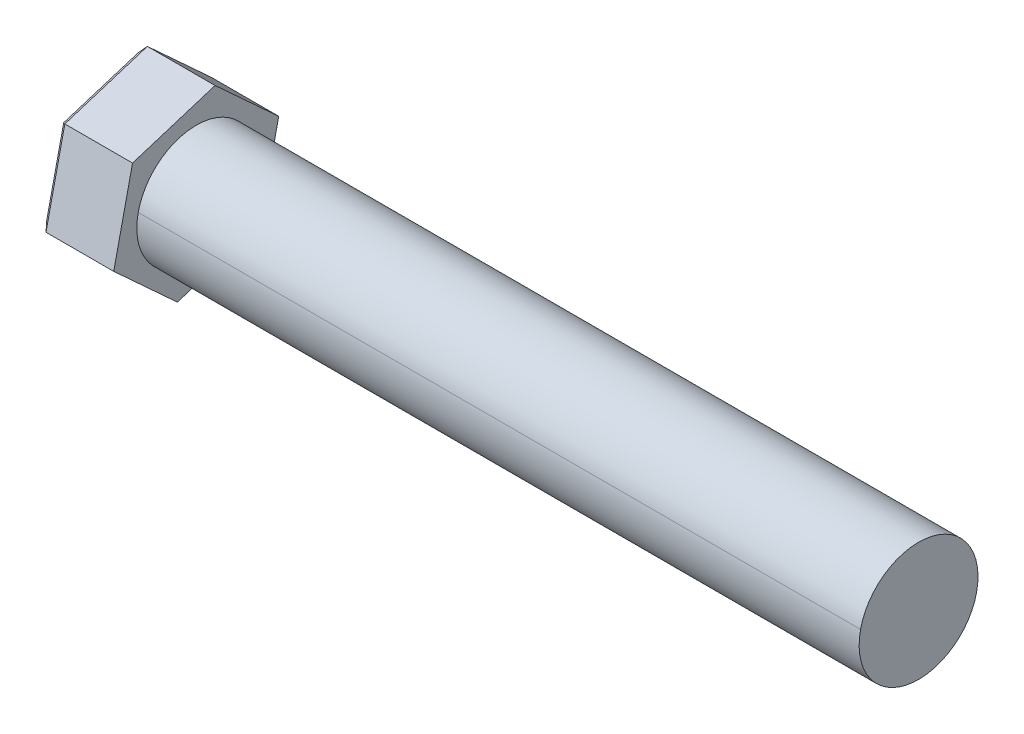
ISO-10303-21;
HEADER;
FILE_DESCRIPTION(('STEP AP214'),'2;1');
FILE_NAME('part.step','',(''),(''),'','','');
FILE_SCHEMA(('AUTOMOTIVE_DESIGN { 1 0 10303 214 1 1 1 1 }'));
ENDSEC;
DATA;
#1=APPLICATION_CONTEXT('core data for automotive mechanical design processes');
#2=APPLICATION_PROTOCOL_DEFINITION('international standard','automotive_design',2000,#1);
#3=PRODUCT_CONTEXT('',#1,'mechanical');
#4=PRODUCT('Part','Part','',(#3));
#5=PRODUCT_RELATED_PRODUCT_CATEGORY('part','',(#4));
#6=PRODUCT_DEFINITION_FORMATION('','',#4);
#7=PRODUCT_DEFINITION_CONTEXT('part definition',#1,'design');
#8=PRODUCT_DEFINITION('design','',#6,#7);
#9=PRODUCT_DEFINITION_SHAPE('','',#8);
#10=(LENGTH_UNIT() NAMED_UNIT(*) SI_UNIT(.MILLI.,.METRE.));
#11=(NAMED_UNIT(*) PLANE_ANGLE_UNIT() SI_UNIT($,.RADIAN.));
#12=(NAMED_UNIT(*) SI_UNIT($,.STERADIAN.) SOLID_ANGLE_UNIT());
#13=UNCERTAINTY_MEASURE_WITH_UNIT(LENGTH_MEASURE(1.E-05),#10,'distance_accuracy_value','');
#14=(GEOMETRIC_REPRESENTATION_CONTEXT(3) GLOBAL_UNCERTAINTY_ASSIGNED_CONTEXT((#13)) GLOBAL_UNIT_ASSIGNED_CONTEXT((#10,
#11,#12)) REPRESENTATION_CONTEXT('',''));
#15=CARTESIAN_POINT('',(0.,0.,0.));
#16=DIRECTION('',(0.,0.,1.));
#17=DIRECTION('',(1.,0.,0.));
#18=AXIS2_PLACEMENT_3D('',#15,#16,#17);
#19=CARTESIAN_POINT('',(-26.156988266467,0.985225507669179,66.1240183170665));
#20=DIRECTION('',(0.707106781186545,-0.520740757908933,0.478360808441112));
#21=DIRECTION('',(0.,-0.676504343005176,-0.736438642315255));
#22=AXIS2_PLACEMENT_3D('',#19,#20,#21);
#23=PLANE('',#22);
#24=DIRECTION('',(0.65465367070798,0.737806867935283,-0.164528408051909));
#25=VECTOR('',#24,1.);
#26=CARTESIAN_POINT('',(-26.7966473512185,2.01318397559738,68.1885836634242));
#27=LINE('',#26,#25);
#28=CARTESIAN_POINT('',(-26.156988266467,2.7340916661576,68.0278237141273));
#29=VERTEX_POINT('',#28);
#30=CARTESIAN_POINT('',(-25.656988266467,3.29760096958621,67.9021630668159));
#31=VERTEX_POINT('',#30);
#32=EDGE_CURVE('E25',#29,#31,#27,.T.);
#33=ORIENTED_EDGE('',*,*,#32,.T.);
#34=DIRECTION('',(0.,0.676504343005176,0.736438642315255));
#35=VECTOR('',#34,1.);
#36=CARTESIAN_POINT('',(-25.656988266467,3.29760096958621,67.9021630668159));
#37=LINE('',#36,#35);
#38=CARTESIAN_POINT('',(-25.656988266467,-0.590711311932603,63.669369224312));
#39=VERTEX_POINT('',#38);
#40=EDGE_CURVE('E219',#39,#31,#37,.T.);
#41=ORIENTED_EDGE('',*,*,#40,.F.);
#42=DIRECTION('',(-0.654653670707981,-0.226417652950475,0.72122369474454));
#43=VECTOR('',#42,1.);
#44=CARTESIAN_POINT('',(-26.7966473512185,-0.984872296097044,64.9249172684629));
#45=LINE('',#44,#43);
#46=CARTESIAN_POINT('',(-26.156988266467,-0.763640650819234,64.2202129200057));
#47=VERTEX_POINT('',#46);
#48=EDGE_CURVE('E11',#39,#47,#45,.T.);
#49=ORIENTED_EDGE('',*,*,#48,.T.);
#50=DIRECTION('',(0.,-0.676504343005176,-0.736438642315255));
#51=VECTOR('',#50,1.);
#52=CARTESIAN_POINT('',(-26.156988266467,0.985225507669179,66.1240183170665));
#53=LINE('',#52,#51);
#54=EDGE_CURVE('E230',#29,#47,#53,.T.);
#55=ORIENTED_EDGE('',*,*,#54,.F.);
#56=EDGE_LOOP('',(#33,#41,#49,#55));
#57=FACE_BOUND('',#56,.T.);
#58=ADVANCED_FACE('F17',(#57),#23,.F.);
#59=CARTESIAN_POINT('',(-26.156988266467,-3.28681756777998,64.7828727425452));
#60=DIRECTION('',(0.707106781186544,0.153902233330398,0.690155129355655));
#61=DIRECTION('',(0.,-0.97602674407612,0.217650625655356));
#62=AXIS2_PLACEMENT_3D('',#59,#60,#61);
#63=PLANE('',#62);
#64=DIRECTION('',(-0.65465367070798,0.511389214984809,0.556695286692629));
#65=VECTOR('',#64,1.);
#66=CARTESIAN_POINT('',(-26.7966473512185,-5.31031843945834,65.8894769642449));
#67=LINE('',#66,#65);
#68=CARTESIAN_POINT('',(-25.656988266467,-6.20057444928272,64.9203495167023));
#69=VERTEX_POINT('',#68);
#70=CARTESIAN_POINT('',(-26.156988266467,-5.80999448474074,65.3455325650847));
#71=VERTEX_POINT('',#70);
#72=EDGE_CURVE('E257',#69,#71,#67,.T.);
#73=ORIENTED_EDGE('',*,*,#72,.T.);
#74=DIRECTION('',(0.,-0.97602674407612,0.217650625655356));
#75=VECTOR('',#74,1.);
#76=CARTESIAN_POINT('',(-26.156988266467,-3.28681756777998,64.7828727425452));
#77=LINE('',#76,#75);
#78=EDGE_CURVE('E234',#47,#71,#77,.T.);
#79=ORIENTED_EDGE('',*,*,#78,.F.);
#80=ORIENTED_EDGE('',*,*,#48,.F.);
#81=DIRECTION('',(0.,0.97602674407612,-0.217650625655356));
#82=VECTOR('',#81,1.);
#83=CARTESIAN_POINT('',(-25.656988266467,-0.590711311932603,63.669369224312));
#84=LINE('',#83,#82);
#85=EDGE_CURVE('E208',#69,#39,#84,.T.);
#86=ORIENTED_EDGE('',*,*,#85,.F.);
#87=EDGE_LOOP('',(#73,#79,#80,#86));
#88=FACE_BOUND('',#87,.T.);
#89=ADVANCED_FACE('F287',(#88),#63,.F.);
#90=CARTESIAN_POINT('',(-26.156988266467,1.95978090768525,70.4942889337275));
#91=DIRECTION('',(0.707106781186545,-0.674642991239331,-0.211794320914543));
#92=DIRECTION('',(0.,0.299522401070945,-0.954089267970611));
#93=AXIS2_PLACEMENT_3D('',#90,#91,#92);
#94=PLANE('',#93);
#95=DIRECTION('',(0.65465367070798,0.511389214984808,0.55669528669263));
#96=VECTOR('',#95,1.);
#97=CARTESIAN_POINT('',(-26.7966473512185,0.685794103930516,72.4168097541675));
#98=LINE('',#97,#96);
#99=CARTESIAN_POINT('',(-26.156988266467,1.18547014921292,72.9607541533277));
#100=VERTEX_POINT('',#99);
#101=CARTESIAN_POINT('',(-25.656988266467,1.5760501137549,73.3859372017101));
#102=VERTEX_POINT('',#101);
#103=EDGE_CURVE('E254',#100,#102,#98,.T.);
#104=ORIENTED_EDGE('',*,*,#103,.T.);
#105=DIRECTION('',(0.,-0.299522401070945,0.954089267970611));
#106=VECTOR('',#105,1.);
#107=CARTESIAN_POINT('',(-25.656988266467,1.5760501137549,73.3859372017101));
#108=LINE('',#107,#106);
#109=EDGE_CURVE('E158',#31,#102,#108,.T.);
#110=ORIENTED_EDGE('',*,*,#109,.F.);
#111=ORIENTED_EDGE('',*,*,#32,.F.);
#112=DIRECTION('',(0.,0.299522401070945,-0.954089267970611));
#113=VECTOR('',#112,1.);
#114=CARTESIAN_POINT('',(-26.156988266467,1.95978090768525,70.4942889337275));
#115=LINE('',#114,#113);
#116=EDGE_CURVE('E226',#100,#29,#115,.T.);
#117=ORIENTED_EDGE('',*,*,#116,.F.);
#118=EDGE_LOOP('',(#104,#110,#111,#117));
#119=FACE_BOUND('',#118,.T.);
#120=ADVANCED_FACE('F271',(#119),#94,.F.);
#121=CARTESIAN_POINT('',(-26.156988266467,-6.58430524321308,67.8119977846849));
#122=DIRECTION('',(0.707106781186545,0.67464299123933,0.211794320914543));
#123=DIRECTION('',(0.,0.299522401070944,-0.954089267970611));
#124=AXIS2_PLACEMENT_3D('',#121,#122,#123);
#125=PLANE('',#124);
#126=DIRECTION('',(-0.65465367070798,0.737806867935283,-0.16452840805191));
#127=VECTOR('',#126,1.);
#128=CARTESIAN_POINT('',(-26.7966473512185,-6.6377083111252,70.1177030549882));
#129=LINE('',#128,#127);
#130=CARTESIAN_POINT('',(-25.656988266467,-7.92212530511403,70.4041236515966));
#131=VERTEX_POINT('',#130);
#132=CARTESIAN_POINT('',(-26.156988266467,-7.35861600168542,70.2784630042852));
#133=VERTEX_POINT('',#132);
#134=EDGE_CURVE('E46',#131,#133,#129,.T.);
#135=ORIENTED_EDGE('',*,*,#134,.T.);
#136=DIRECTION('',(0.,-0.299522401070945,0.954089267970611));
#137=VECTOR('',#136,1.);
#138=CARTESIAN_POINT('',(-26.156988266467,-6.58430524321308,67.8119977846849));
#139=LINE('',#138,#137);
#140=EDGE_CURVE('E238',#71,#133,#139,.T.);
#141=ORIENTED_EDGE('',*,*,#140,.F.);
#142=ORIENTED_EDGE('',*,*,#72,.F.);
#143=DIRECTION('',(0.,0.299522401070945,-0.954089267970611));
#144=VECTOR('',#143,1.);
#145=CARTESIAN_POINT('',(-25.656988266467,-6.20057444928272,64.9203495167023));
#146=LINE('',#145,#144);
#147=EDGE_CURVE('E197',#131,#69,#146,.T.);
#148=ORIENTED_EDGE('',*,*,#147,.F.);
#149=EDGE_LOOP('',(#135,#141,#142,#148));
#150=FACE_BOUND('',#149,.T.);
#151=ADVANCED_FACE('F300',(#150),#125,.F.);
#152=CARTESIAN_POINT('',(-26.156988266467,-1.33770676774784,73.5234139758672));
#153=DIRECTION('',(0.707106781186545,-0.153902233330397,-0.690155129355654));
#154=DIRECTION('',(0.,-0.97602674407612,0.217650625655355));
#155=AXIS2_PLACEMENT_3D('',#152,#153,#154);
#156=PLANE('',#155);
#157=DIRECTION('',(0.65465367070798,-0.226417652950476,0.72122369474454));
#158=VECTOR('',#157,1.);
#159=CARTESIAN_POINT('',(-26.7966473512185,-3.63965203943078,73.3813694499495));
#160=LINE('',#159,#158);
#161=CARTESIAN_POINT('',(-26.156988266467,-3.86088368470859,74.0860737984067));
#162=VERTEX_POINT('',#161);
#163=CARTESIAN_POINT('',(-25.656988266467,-4.03381302359522,74.6369174941005));
#164=VERTEX_POINT('',#163);
#165=EDGE_CURVE('E36',#162,#164,#160,.T.);
#166=ORIENTED_EDGE('',*,*,#165,.T.);
#167=DIRECTION('',(0.,-0.97602674407612,0.217650625655356));
#168=VECTOR('',#167,1.);
#169=CARTESIAN_POINT('',(-25.656988266467,-4.03381302359522,74.6369174941005));
#170=LINE('',#169,#168);
#171=EDGE_CURVE('E165',#102,#164,#170,.T.);
#172=ORIENTED_EDGE('',*,*,#171,.F.);
#173=ORIENTED_EDGE('',*,*,#103,.F.);
#174=DIRECTION('',(0.,0.97602674407612,-0.217650625655356));
#175=VECTOR('',#174,1.);
#176=CARTESIAN_POINT('',(-26.156988266467,-1.33770676774784,73.5234139758672));
#177=LINE('',#176,#175);
#178=EDGE_CURVE('E246',#162,#100,#177,.T.);
#179=ORIENTED_EDGE('',*,*,#178,.F.);
#180=EDGE_LOOP('',(#166,#172,#173,#179));
#181=FACE_BOUND('',#180,.T.);
#182=ADVANCED_FACE('F292',(#181),#156,.F.);
#183=CARTESIAN_POINT('',(-26.156988266467,-5.609749843197,72.182268401346));
#184=DIRECTION('',(0.707106781186545,0.520740757908933,-0.478360808441112));
#185=DIRECTION('',(0.,-0.676504343005176,-0.736438642315255));
#186=AXIS2_PLACEMENT_3D('',#183,#184,#185);
#187=PLANE('',#186);
#188=ORIENTED_EDGE('',*,*,#134,.F.);
#189=DIRECTION('',(0.,-0.676504343005176,-0.736438642315255));
#190=VECTOR('',#189,1.);
#191=CARTESIAN_POINT('',(-25.656988266467,-7.92212530511403,70.4041236515966));
#192=LINE('',#191,#190);
#193=EDGE_CURVE('E186',#164,#131,#192,.T.);
#194=ORIENTED_EDGE('',*,*,#193,.F.);
#195=ORIENTED_EDGE('',*,*,#165,.F.);
#196=DIRECTION('',(0.,0.676504343005176,0.736438642315255));
#197=VECTOR('',#196,1.);
#198=CARTESIAN_POINT('',(-26.156988266467,-5.609749843197,72.182268401346));
#199=LINE('',#198,#197);
#200=EDGE_CURVE('E242',#133,#162,#199,.T.);
#201=ORIENTED_EDGE('',*,*,#200,.F.);
#202=EDGE_LOOP('',(#188,#194,#195,#201));
#203=FACE_BOUND('',#202,.T.);
#204=ADVANCED_FACE('F308',(#203),#187,.F.);
#205=CARTESIAN_POINT('',(-26.156988266467,-2.31226216776391,69.1531433592062));
#206=DIRECTION('',(-1.,0.,0.));
#207=DIRECTION('',(0.,1.,0.));
#208=AXIS2_PLACEMENT_3D('',#205,#206,#207);
#209=PLANE('',#208);
#210=ORIENTED_EDGE('',*,*,#116,.T.);
#211=ORIENTED_EDGE('',*,*,#54,.T.);
#212=ORIENTED_EDGE('',*,*,#78,.T.);
#213=ORIENTED_EDGE('',*,*,#140,.T.);
#214=ORIENTED_EDGE('',*,*,#200,.T.);
#215=ORIENTED_EDGE('',*,*,#178,.T.);
#216=EDGE_LOOP('',(#210,#211,#212,#213,#214,#215));
#217=FACE_BOUND('',#216,.T.);
#218=ADVANCED_FACE('F290',(#217),#209,.T.);
#219=CARTESIAN_POINT('',(-21.156988266467,-2.31226216776391,69.1531433592062));
#220=DIRECTION('',(-1.,0.,0.));
#221=DIRECTION('',(0.,1.,0.));
#222=AXIS2_PLACEMENT_3D('',#219,#220,#221);
#223=PLANE('',#222);
#224=CARTESIAN_POINT('',(-21.156988266467,-2.31226216776391,69.1531433592062));
#225=DIRECTION('',(-1.,0.,0.));
#226=DIRECTION('',(0.,0.217650625655356,0.97602674407612));
#227=AXIS2_PLACEMENT_3D('',#224,#225,#226);
#228=CIRCLE('',#227,3.95);
#229=CARTESIAN_POINT('',(-21.156988266467,-3.17198213910257,65.2978377201056));
#230=VERTEX_POINT('',#229);
#231=CARTESIAN_POINT('',(-21.156988266467,-1.45254219642525,73.0084489983069));
#232=VERTEX_POINT('',#231);
#233=EDGE_CURVE('E126',#230,#232,#228,.T.);
#234=ORIENTED_EDGE('',*,*,#233,.T.);
#235=CARTESIAN_POINT('',(-21.156988266467,-2.31226216776391,69.1531433592062));
#236=DIRECTION('',(-1.,0.,0.));
#237=DIRECTION('',(0.,0.217650625655356,0.97602674407612));
#238=AXIS2_PLACEMENT_3D('',#235,#236,#237);
#239=CIRCLE('',#238,3.95);
#240=EDGE_CURVE('E131',#232,#230,#239,.T.);
#241=ORIENTED_EDGE('',*,*,#240,.T.);
#242=EDGE_LOOP('',(#234,#241));
#243=FACE_BOUND('',#242,.T.);
#244=DIRECTION('',(0.,0.299522401070945,-0.954089267970611));
#245=VECTOR('',#244,1.);
#246=CARTESIAN_POINT('',(-21.156988266467,1.5760501137549,73.3859372017101));
#247=LINE('',#246,#245);
#248=CARTESIAN_POINT('',(-21.156988266467,1.5760501137549,73.3859372017101));
#249=VERTEX_POINT('',#248);
#250=CARTESIAN_POINT('',(-21.156988266467,3.29760096958621,67.9021630668159));
#251=VERTEX_POINT('',#250);
#252=EDGE_CURVE('E157',#249,#251,#247,.T.);
#253=ORIENTED_EDGE('',*,*,#252,.F.);
#254=DIRECTION('',(0.,0.97602674407612,-0.217650625655356));
#255=VECTOR('',#254,1.);
#256=CARTESIAN_POINT('',(-21.156988266467,-4.03381302359522,74.6369174941005));
#257=LINE('',#256,#255);
#258=CARTESIAN_POINT('',(-21.156988266467,-4.03381302359522,74.6369174941005));
#259=VERTEX_POINT('',#258);
#260=EDGE_CURVE('E173',#259,#249,#257,.T.);
#261=ORIENTED_EDGE('',*,*,#260,.F.);
#262=DIRECTION('',(0.,0.676504343005176,0.736438642315255));
#263=VECTOR('',#262,1.);
#264=CARTESIAN_POINT('',(-21.156988266467,-7.92212530511403,70.4041236515966));
#265=LINE('',#264,#263);
#266=CARTESIAN_POINT('',(-21.156988266467,-7.92212530511403,70.4041236515966));
#267=VERTEX_POINT('',#266);
#268=EDGE_CURVE('E194',#267,#259,#265,.T.);
#269=ORIENTED_EDGE('',*,*,#268,.F.);
#270=DIRECTION('',(0.,-0.299522401070945,0.954089267970611));
#271=VECTOR('',#270,1.);
#272=CARTESIAN_POINT('',(-21.156988266467,-6.20057444928272,64.9203495167023));
#273=LINE('',#272,#271);
#274=CARTESIAN_POINT('',(-21.156988266467,-6.20057444928272,64.9203495167023));
#275=VERTEX_POINT('',#274);
#276=EDGE_CURVE('E205',#275,#267,#273,.T.);
#277=ORIENTED_EDGE('',*,*,#276,.F.);
#278=DIRECTION('',(0.,-0.97602674407612,0.217650625655356));
#279=VECTOR('',#278,1.);
#280=CARTESIAN_POINT('',(-21.156988266467,-0.590711311932603,63.669369224312));
#281=LINE('',#280,#279);
#282=CARTESIAN_POINT('',(-21.156988266467,-0.590711311932603,63.669369224312));
#283=VERTEX_POINT('',#282);
#284=EDGE_CURVE('E216',#283,#275,#281,.T.);
#285=ORIENTED_EDGE('',*,*,#284,.F.);
#286=DIRECTION('',(0.,-0.676504343005176,-0.736438642315255));
#287=VECTOR('',#286,1.);
#288=CARTESIAN_POINT('',(-21.156988266467,3.29760096958621,67.9021630668159));
#289=LINE('',#288,#287);
#290=EDGE_CURVE('E223',#251,#283,#289,.T.);
#291=ORIENTED_EDGE('',*,*,#290,.F.);
#292=EDGE_LOOP('',(#253,#261,#269,#277,#285,#291));
#293=FACE_BOUND('',#292,.T.);
#294=ADVANCED_FACE('F128',(#243,#293),#223,.F.);
#295=CARTESIAN_POINT('',(-21.156988266467,3.29760096958621,67.9021630668159));
#296=DIRECTION('',(0.,0.736438642315255,-0.676504343005176));
#297=DIRECTION('',(-1.,0.,0.));
#298=AXIS2_PLACEMENT_3D('',#295,#296,#297);
#299=PLANE('',#298);
#300=DIRECTION('',(-1.,0.,0.));
#301=VECTOR('',#300,1.);
#302=CARTESIAN_POINT('',(-21.156988266467,-0.590711311932603,63.669369224312));
#303=LINE('',#302,#301);
#304=EDGE_CURVE('E212',#283,#39,#303,.T.);
#305=ORIENTED_EDGE('',*,*,#304,.T.);
#306=ORIENTED_EDGE('',*,*,#40,.T.);
#307=DIRECTION('',(-1.,0.,0.));
#308=VECTOR('',#307,1.);
#309=CARTESIAN_POINT('',(-21.156988266467,3.29760096958621,67.9021630668159));
#310=LINE('',#309,#308);
#311=EDGE_CURVE('E160',#251,#31,#310,.T.);
#312=ORIENTED_EDGE('',*,*,#311,.F.);
#313=ORIENTED_EDGE('',*,*,#290,.T.);
#314=EDGE_LOOP('',(#305,#306,#312,#313));
#315=FACE_BOUND('',#314,.T.);
#316=ADVANCED_FACE('F269',(#315),#299,.T.);
#317=CARTESIAN_POINT('',(-21.156988266467,-0.590711311932603,63.669369224312));
#318=DIRECTION('',(0.,-0.217650625655356,-0.97602674407612));
#319=DIRECTION('',(0.,-0.97602674407612,0.217650625655356));
#320=AXIS2_PLACEMENT_3D('',#317,#318,#319);
#321=PLANE('',#320);
#322=DIRECTION('',(-1.,0.,0.));
#323=VECTOR('',#322,1.);
#324=CARTESIAN_POINT('',(-21.156988266467,-6.20057444928272,64.9203495167023));
#325=LINE('',#324,#323);
#326=EDGE_CURVE('E201',#275,#69,#325,.T.);
#327=ORIENTED_EDGE('',*,*,#326,.T.);
#328=ORIENTED_EDGE('',*,*,#85,.T.);
#329=ORIENTED_EDGE('',*,*,#304,.F.);
#330=ORIENTED_EDGE('',*,*,#284,.T.);
#331=EDGE_LOOP('',(#327,#328,#329,#330));
#332=FACE_BOUND('',#331,.T.);
#333=ADVANCED_FACE('F284',(#332),#321,.T.);
#334=CARTESIAN_POINT('',(-21.156988266467,-6.20057444928272,64.9203495167023));
#335=DIRECTION('',(0.,-0.954089267970611,-0.299522401070945));
#336=DIRECTION('',(0.,0.299522401070945,-0.954089267970611));
#337=AXIS2_PLACEMENT_3D('',#334,#335,#336);
#338=PLANE('',#337);
#339=DIRECTION('',(-1.,0.,0.));
#340=VECTOR('',#339,1.);
#341=CARTESIAN_POINT('',(-21.156988266467,-7.92212530511403,70.4041236515966));
#342=LINE('',#341,#340);
#343=EDGE_CURVE('E190',#267,#131,#342,.T.);
#344=ORIENTED_EDGE('',*,*,#343,.T.);
#345=ORIENTED_EDGE('',*,*,#147,.T.);
#346=ORIENTED_EDGE('',*,*,#326,.F.);
#347=ORIENTED_EDGE('',*,*,#276,.T.);
#348=EDGE_LOOP('',(#344,#345,#346,#347));
#349=FACE_BOUND('',#348,.T.);
#350=ADVANCED_FACE('F299',(#349),#338,.T.);
#351=CARTESIAN_POINT('',(-21.156988266467,-7.92212530511403,70.4041236515966));
#352=DIRECTION('',(0.,-0.736438642315255,0.676504343005176));
#353=DIRECTION('',(-1.,0.,0.));
#354=AXIS2_PLACEMENT_3D('',#351,#352,#353);
#355=PLANE('',#354);
#356=DIRECTION('',(-1.,0.,0.));
#357=VECTOR('',#356,1.);
#358=CARTESIAN_POINT('',(-21.156988266467,-4.03381302359522,74.6369174941005));
#359=LINE('',#358,#357);
#360=EDGE_CURVE('E170',#259,#164,#359,.T.);
#361=ORIENTED_EDGE('',*,*,#360,.T.);
#362=ORIENTED_EDGE('',*,*,#193,.T.);
#363=ORIENTED_EDGE('',*,*,#343,.F.);
#364=ORIENTED_EDGE('',*,*,#268,.T.);
#365=EDGE_LOOP('',(#361,#362,#363,#364));
#366=FACE_BOUND('',#365,.T.);
#367=ADVANCED_FACE('F296',(#366),#355,.T.);
#368=CARTESIAN_POINT('',(-21.156988266467,-4.03381302359522,74.6369174941005));
#369=DIRECTION('',(0.,0.217650625655356,0.97602674407612));
#370=DIRECTION('',(1.,0.,0.));
#371=AXIS2_PLACEMENT_3D('',#368,#369,#370);
#372=PLANE('',#371);
#373=DIRECTION('',(-1.,0.,0.));
#374=VECTOR('',#373,1.);
#375=CARTESIAN_POINT('',(-21.156988266467,1.5760501137549,73.3859372017101));
#376=LINE('',#375,#374);
#377=EDGE_CURVE('E154',#249,#102,#376,.T.);
#378=ORIENTED_EDGE('',*,*,#377,.T.);
#379=ORIENTED_EDGE('',*,*,#171,.T.);
#380=ORIENTED_EDGE('',*,*,#360,.F.);
#381=ORIENTED_EDGE('',*,*,#260,.T.);
#382=EDGE_LOOP('',(#378,#379,#380,#381));
#383=FACE_BOUND('',#382,.T.);
#384=ADVANCED_FACE('F294',(#383),#372,.T.);
#385=CARTESIAN_POINT('',(-21.156988266467,1.5760501137549,73.3859372017101));
#386=DIRECTION('',(0.,0.954089267970611,0.299522401070945));
#387=DIRECTION('',(1.,0.,0.));
#388=AXIS2_PLACEMENT_3D('',#385,#386,#387);
#389=PLANE('',#388);
#390=ORIENTED_EDGE('',*,*,#311,.T.);
#391=ORIENTED_EDGE('',*,*,#109,.T.);
#392=ORIENTED_EDGE('',*,*,#377,.F.);
#393=ORIENTED_EDGE('',*,*,#252,.T.);
#394=EDGE_LOOP('',(#390,#391,#392,#393));
#395=FACE_BOUND('',#394,.T.);
#396=ADVANCED_FACE('F275',(#395),#389,.T.);
#397=CARTESIAN_POINT('',(26.843011733533,-2.31226216776391,69.1531433592062));
#398=DIRECTION('',(-1.,0.,0.));
#399=DIRECTION('',(0.,1.,0.));
#400=AXIS2_PLACEMENT_3D('',#397,#398,#399);
#401=PLANE('',#400);
#402=CARTESIAN_POINT('',(26.843011733533,-2.31226216776391,69.1531433592062));
#403=DIRECTION('',(-1.,0.,0.));
#404=DIRECTION('',(0.,0.217650625655356,0.97602674407612));
#405=AXIS2_PLACEMENT_3D('',#402,#403,#404);
#406=CIRCLE('',#405,3.95);
#407=CARTESIAN_POINT('',(26.843011733533,-3.17198213910257,65.2978377201056));
#408=VERTEX_POINT('',#407);
#409=CARTESIAN_POINT('',(26.843011733533,-1.45254219642525,73.0084489983069));
#410=VERTEX_POINT('',#409);
#411=EDGE_CURVE('E136',#408,#410,#406,.T.);
#412=ORIENTED_EDGE('',*,*,#411,.F.);
#413=CARTESIAN_POINT('',(26.843011733533,-2.31226216776391,69.1531433592062));
#414=DIRECTION('',(-1.,0.,0.));
#415=DIRECTION('',(0.,0.217650625655356,0.97602674407612));
#416=AXIS2_PLACEMENT_3D('',#413,#414,#415);
#417=CIRCLE('',#416,3.95);
#418=EDGE_CURVE('E146',#410,#408,#417,.T.);
#419=ORIENTED_EDGE('',*,*,#418,.F.);
#420=EDGE_LOOP('',(#412,#419));
#421=FACE_BOUND('',#420,.T.);
#422=ADVANCED_FACE('F375',(#421),#401,.F.);
#423=CARTESIAN_POINT('',(-26.156988266467,-2.31226216776391,69.1531433592062));
#424=DIRECTION('',(1.,0.,0.));
#425=DIRECTION('',(0.,-0.217650625655356,-0.97602674407612));
#426=AXIS2_PLACEMENT_3D('',#423,#424,#425);
#427=CYLINDRICAL_SURFACE('',#426,3.95);
#428=DIRECTION('',(1.,0.,0.));
#429=VECTOR('',#428,1.);
#430=CARTESIAN_POINT('',(-26.156988266467,-1.45254219642525,73.0084489983069));
#431=LINE('',#430,#429);
#432=EDGE_CURVE('E140',#232,#410,#431,.T.);
#433=ORIENTED_EDGE('',*,*,#432,.F.);
#434=ORIENTED_EDGE('',*,*,#233,.F.);
#435=DIRECTION('',(1.,0.,0.));
#436=VECTOR('',#435,1.);
#437=CARTESIAN_POINT('',(-26.156988266467,-3.17198213910257,65.2978377201056));
#438=LINE('',#437,#436);
#439=EDGE_CURVE('E137',#230,#408,#438,.T.);
#440=ORIENTED_EDGE('',*,*,#439,.T.);
#441=ORIENTED_EDGE('',*,*,#411,.T.);
#442=EDGE_LOOP('',(#433,#434,#440,#441));
#443=FACE_BOUND('',#442,.T.);
#444=ADVANCED_FACE('F141',(#443),#427,.T.);
#445=CARTESIAN_POINT('',(-26.156988266467,-2.31226216776391,69.1531433592062));
#446=DIRECTION('',(1.,0.,0.));
#447=DIRECTION('',(0.,-0.217650625655356,-0.97602674407612));
#448=AXIS2_PLACEMENT_3D('',#445,#446,#447);
#449=CYLINDRICAL_SURFACE('',#448,3.95);
#450=ORIENTED_EDGE('',*,*,#240,.F.);
#451=ORIENTED_EDGE('',*,*,#432,.T.);
#452=ORIENTED_EDGE('',*,*,#418,.T.);
#453=ORIENTED_EDGE('',*,*,#439,.F.);
#454=EDGE_LOOP('',(#450,#451,#452,#453));
#455=FACE_BOUND('',#454,.T.);
#456=ADVANCED_FACE('F148',(#455),#449,.T.);
#457=CLOSED_SHELL('',(#58,#89,#120,#151,#182,#204,#218,#294,#316,#333,#350,#367,#384,#396,#422,
#444,#456));
#458=MANIFOLD_SOLID_BREP('B1',#457);
#459=ADVANCED_BREP_SHAPE_REPRESENTATION('',(#18,#458),#14);
#460=SHAPE_DEFINITION_REPRESENTATION(#9,#459);
ENDSEC;
END-ISO-10303-21;
